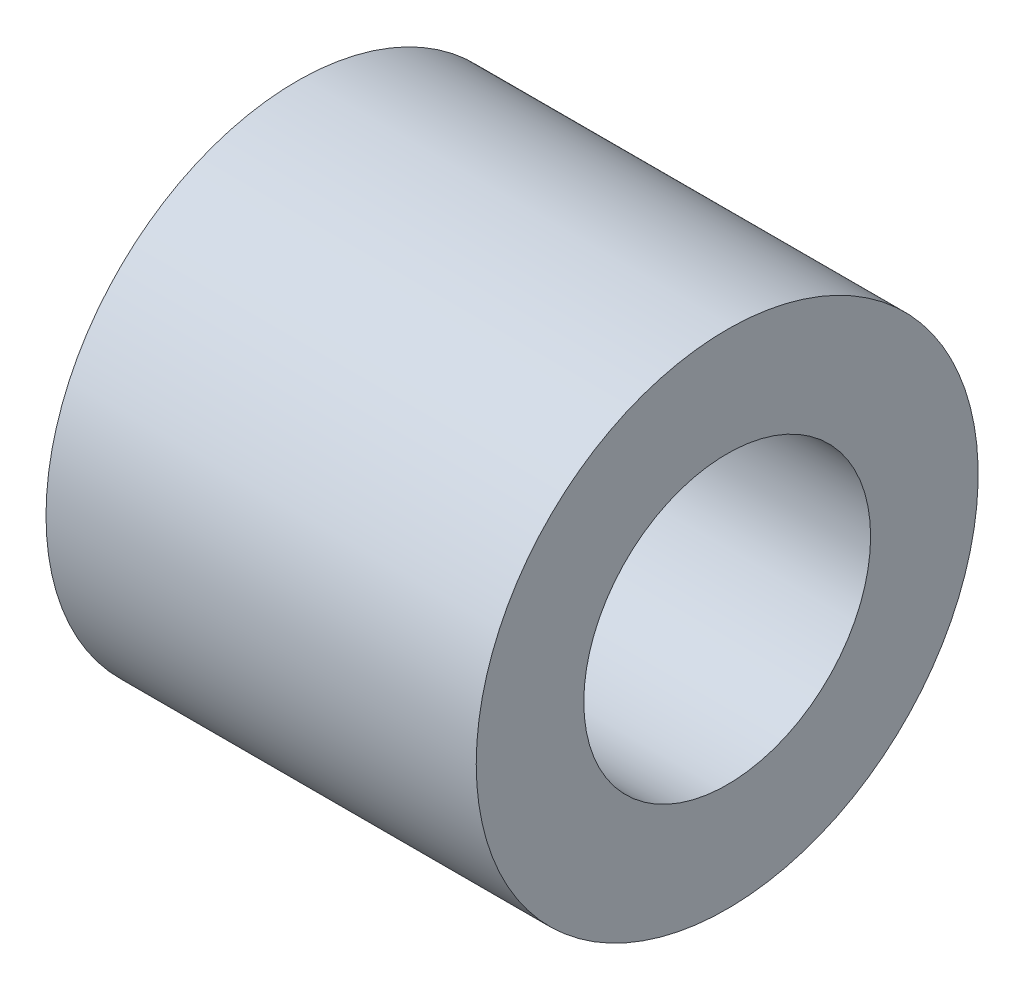
ISO-10303-21;
HEADER;
FILE_DESCRIPTION(('STEP AP214'),'2;1');
FILE_NAME('part.step','',(''),(''),'','','');
FILE_SCHEMA(('AUTOMOTIVE_DESIGN { 1 0 10303 214 1 1 1 1 }'));
ENDSEC;
DATA;
#1=APPLICATION_CONTEXT('core data for automotive mechanical design processes');
#2=APPLICATION_PROTOCOL_DEFINITION('international standard','automotive_design',2000,#1);
#3=PRODUCT_CONTEXT('',#1,'mechanical');
#4=PRODUCT('Part','Part','',(#3));
#5=PRODUCT_RELATED_PRODUCT_CATEGORY('part','',(#4));
#6=PRODUCT_DEFINITION_FORMATION('','',#4);
#7=PRODUCT_DEFINITION_CONTEXT('part definition',#1,'design');
#8=PRODUCT_DEFINITION('design','',#6,#7);
#9=PRODUCT_DEFINITION_SHAPE('','',#8);
#10=(LENGTH_UNIT() NAMED_UNIT(*) SI_UNIT(.MILLI.,.METRE.));
#11=(NAMED_UNIT(*) PLANE_ANGLE_UNIT() SI_UNIT($,.RADIAN.));
#12=(NAMED_UNIT(*) SI_UNIT($,.STERADIAN.) SOLID_ANGLE_UNIT());
#13=UNCERTAINTY_MEASURE_WITH_UNIT(LENGTH_MEASURE(1.E-05),#10,'distance_accuracy_value','');
#14=(GEOMETRIC_REPRESENTATION_CONTEXT(3) GLOBAL_UNCERTAINTY_ASSIGNED_CONTEXT((#13)) GLOBAL_UNIT_ASSIGNED_CONTEXT((#10,
#11,#12)) REPRESENTATION_CONTEXT('',''));
#15=CARTESIAN_POINT('',(0.,0.,0.));
#16=DIRECTION('',(0.,0.,1.));
#17=DIRECTION('',(1.,0.,0.));
#18=AXIS2_PLACEMENT_3D('',#15,#16,#17);
#19=CARTESIAN_POINT('',(0.,0.,0.));
#20=DIRECTION('',(-1.,0.,0.));
#21=DIRECTION('',(0.,0.,1.));
#22=AXIS2_PLACEMENT_3D('',#19,#20,#21);
#23=CYLINDRICAL_SURFACE('',#22,4.);
#24=CARTESIAN_POINT('',(12.,0.,0.));
#25=DIRECTION('',(-1.,0.,0.));
#26=DIRECTION('',(0.,0.,1.));
#27=AXIS2_PLACEMENT_3D('',#24,#25,#26);
#28=CIRCLE('',#27,4.);
#29=CARTESIAN_POINT('',(12.,0.,4.));
#30=VERTEX_POINT('',#29);
#31=EDGE_CURVE('E10',#30,#30,#28,.T.);
#32=ORIENTED_EDGE('',*,*,#31,.F.);
#33=EDGE_LOOP('',(#32));
#34=FACE_BOUND('',#33,.T.);
#35=CARTESIAN_POINT('',(0.,0.,0.));
#36=DIRECTION('',(-1.,0.,0.));
#37=DIRECTION('',(0.,0.,1.));
#38=AXIS2_PLACEMENT_3D('',#35,#36,#37);
#39=CIRCLE('',#38,4.);
#40=CARTESIAN_POINT('',(0.,0.,4.));
#41=VERTEX_POINT('',#40);
#42=EDGE_CURVE('E49',#41,#41,#39,.T.);
#43=ORIENTED_EDGE('',*,*,#42,.T.);
#44=EDGE_LOOP('',(#43));
#45=FACE_BOUND('',#44,.T.);
#46=ADVANCED_FACE('F35',(#34,#45),#23,.F.);
#47=CARTESIAN_POINT('',(12.,0.,0.));
#48=DIRECTION('',(-1.,0.,0.));
#49=DIRECTION('',(0.,0.,1.));
#50=AXIS2_PLACEMENT_3D('',#47,#48,#49);
#51=PLANE('',#50);
#52=CARTESIAN_POINT('',(12.,0.,0.));
#53=DIRECTION('',(-1.,0.,0.));
#54=DIRECTION('',(0.,0.,1.));
#55=AXIS2_PLACEMENT_3D('',#52,#53,#54);
#56=CIRCLE('',#55,7.);
#57=CARTESIAN_POINT('',(12.,0.,7.));
#58=VERTEX_POINT('',#57);
#59=EDGE_CURVE('E41',#58,#58,#56,.T.);
#60=ORIENTED_EDGE('',*,*,#59,.F.);
#61=EDGE_LOOP('',(#60));
#62=FACE_BOUND('',#61,.T.);
#63=ORIENTED_EDGE('',*,*,#31,.T.);
#64=EDGE_LOOP('',(#63));
#65=FACE_BOUND('',#64,.T.);
#66=ADVANCED_FACE('F64',(#62,#65),#51,.F.);
#67=CARTESIAN_POINT('',(0.,0.,0.));
#68=DIRECTION('',(-1.,0.,0.));
#69=DIRECTION('',(0.,0.,1.));
#70=AXIS2_PLACEMENT_3D('',#67,#68,#69);
#71=CYLINDRICAL_SURFACE('',#70,7.);
#72=ORIENTED_EDGE('',*,*,#59,.T.);
#73=EDGE_LOOP('',(#72));
#74=FACE_BOUND('',#73,.T.);
#75=CARTESIAN_POINT('',(0.,0.,0.));
#76=DIRECTION('',(-1.,0.,0.));
#77=DIRECTION('',(0.,0.,1.));
#78=AXIS2_PLACEMENT_3D('',#75,#76,#77);
#79=CIRCLE('',#78,7.);
#80=CARTESIAN_POINT('',(0.,0.,7.));
#81=VERTEX_POINT('',#80);
#82=EDGE_CURVE('E45',#81,#81,#79,.T.);
#83=ORIENTED_EDGE('',*,*,#82,.F.);
#84=EDGE_LOOP('',(#83));
#85=FACE_BOUND('',#84,.T.);
#86=ADVANCED_FACE('F58',(#74,#85),#71,.T.);
#87=CARTESIAN_POINT('',(0.,0.,0.));
#88=DIRECTION('',(-1.,0.,0.));
#89=DIRECTION('',(0.,0.,1.));
#90=AXIS2_PLACEMENT_3D('',#87,#88,#89);
#91=PLANE('',#90);
#92=ORIENTED_EDGE('',*,*,#82,.T.);
#93=EDGE_LOOP('',(#92));
#94=FACE_BOUND('',#93,.T.);
#95=ORIENTED_EDGE('',*,*,#42,.F.);
#96=EDGE_LOOP('',(#95));
#97=FACE_BOUND('',#96,.T.);
#98=ADVANCED_FACE('F56',(#94,#97),#91,.T.);
#99=CLOSED_SHELL('',(#46,#66,#86,#98));
#100=MANIFOLD_SOLID_BREP('B2',#99);
#101=ADVANCED_BREP_SHAPE_REPRESENTATION('',(#18,#100),#14);
#102=SHAPE_DEFINITION_REPRESENTATION(#9,#101);
ENDSEC;
END-ISO-10303-21;
